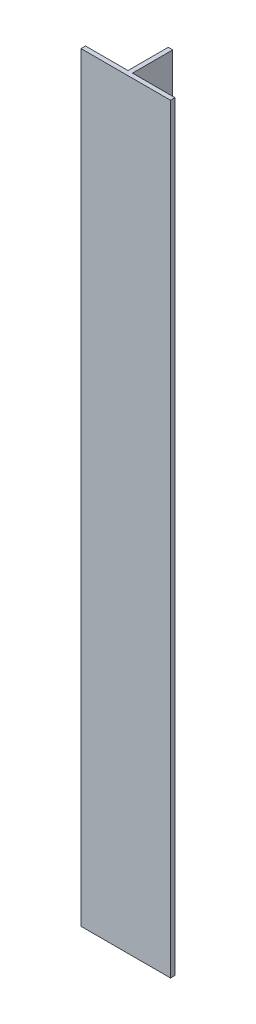
ISO-10303-21;
HEADER;
FILE_DESCRIPTION(('STEP AP214'),'2;1');
FILE_NAME('part.step','',(''),(''),'','','');
FILE_SCHEMA(('AUTOMOTIVE_DESIGN { 1 0 10303 214 1 1 1 1 }'));
ENDSEC;
DATA;
#1=APPLICATION_CONTEXT('core data for automotive mechanical design processes');
#2=APPLICATION_PROTOCOL_DEFINITION('international standard','automotive_design',2000,#1);
#3=PRODUCT_CONTEXT('',#1,'mechanical');
#4=PRODUCT('Part','Part','',(#3));
#5=PRODUCT_RELATED_PRODUCT_CATEGORY('part','',(#4));
#6=PRODUCT_DEFINITION_FORMATION('','',#4);
#7=PRODUCT_DEFINITION_CONTEXT('part definition',#1,'design');
#8=PRODUCT_DEFINITION('design','',#6,#7);
#9=PRODUCT_DEFINITION_SHAPE('','',#8);
#10=(LENGTH_UNIT() NAMED_UNIT(*) SI_UNIT(.MILLI.,.METRE.));
#11=(NAMED_UNIT(*) PLANE_ANGLE_UNIT() SI_UNIT($,.RADIAN.));
#12=(NAMED_UNIT(*) SI_UNIT($,.STERADIAN.) SOLID_ANGLE_UNIT());
#13=UNCERTAINTY_MEASURE_WITH_UNIT(LENGTH_MEASURE(1.E-05),#10,'distance_accuracy_value','');
#14=(GEOMETRIC_REPRESENTATION_CONTEXT(3) GLOBAL_UNCERTAINTY_ASSIGNED_CONTEXT((#13)) GLOBAL_UNIT_ASSIGNED_CONTEXT((#10,
#11,#12)) REPRESENTATION_CONTEXT('',''));
#15=CARTESIAN_POINT('',(0.,0.,0.));
#16=DIRECTION('',(0.,0.,1.));
#17=DIRECTION('',(1.,0.,0.));
#18=AXIS2_PLACEMENT_3D('',#15,#16,#17);
#19=CARTESIAN_POINT('',(-19.,340.,-5.36108675888797));
#20=DIRECTION('',(0.,0.,1.));
#21=DIRECTION('',(1.,0.,0.));
#22=AXIS2_PLACEMENT_3D('',#19,#20,#21);
#23=PLANE('',#22);
#24=DIRECTION('',(-1.,0.,0.));
#25=VECTOR('',#24,1.);
#26=CARTESIAN_POINT('',(-19.,0.,-5.36108675888797));
#27=LINE('',#26,#25);
#28=CARTESIAN_POINT('',(0.,0.,-5.36108675888797));
#29=VERTEX_POINT('',#28);
#30=CARTESIAN_POINT('',(-19.,0.,-5.36108675888797));
#31=VERTEX_POINT('',#30);
#32=EDGE_CURVE('E129',#29,#31,#27,.T.);
#33=ORIENTED_EDGE('',*,*,#32,.T.);
#34=DIRECTION('',(0.,-1.,0.));
#35=VECTOR('',#34,1.);
#36=CARTESIAN_POINT('',(-19.,340.,-5.36108675888797));
#37=LINE('',#36,#35);
#38=CARTESIAN_POINT('',(-19.,340.,-5.36108675888797));
#39=VERTEX_POINT('',#38);
#40=EDGE_CURVE('E11',#39,#31,#37,.T.);
#41=ORIENTED_EDGE('',*,*,#40,.F.);
#42=DIRECTION('',(-1.,0.,0.));
#43=VECTOR('',#42,1.);
#44=CARTESIAN_POINT('',(-19.,340.,-5.36108675888797));
#45=LINE('',#44,#43);
#46=CARTESIAN_POINT('',(0.,340.,-5.36108675888797));
#47=VERTEX_POINT('',#46);
#48=EDGE_CURVE('E143',#47,#39,#45,.T.);
#49=ORIENTED_EDGE('',*,*,#48,.F.);
#50=DIRECTION('',(0.,-1.,0.));
#51=VECTOR('',#50,1.);
#52=CARTESIAN_POINT('',(0.,340.,-5.36108675888797));
#53=LINE('',#52,#51);
#54=EDGE_CURVE('E125',#47,#29,#53,.T.);
#55=ORIENTED_EDGE('',*,*,#54,.T.);
#56=EDGE_LOOP('',(#33,#41,#49,#55));
#57=FACE_BOUND('',#56,.T.);
#58=ADVANCED_FACE('F33',(#57),#23,.F.);
#59=CARTESIAN_POINT('',(-19.,340.,-3.36108675888797));
#60=DIRECTION('',(1.,0.,0.));
#61=DIRECTION('',(0.,0.,-1.));
#62=AXIS2_PLACEMENT_3D('',#59,#60,#61);
#63=PLANE('',#62);
#64=DIRECTION('',(0.,0.,1.));
#65=VECTOR('',#64,1.);
#66=CARTESIAN_POINT('',(-19.,0.,-3.36108675888797));
#67=LINE('',#66,#65);
#68=CARTESIAN_POINT('',(-19.,0.,-3.36108675888797));
#69=VERTEX_POINT('',#68);
#70=EDGE_CURVE('E132',#31,#69,#67,.T.);
#71=ORIENTED_EDGE('',*,*,#70,.T.);
#72=DIRECTION('',(0.,-1.,0.));
#73=VECTOR('',#72,1.);
#74=CARTESIAN_POINT('',(-19.,340.,-3.36108675888797));
#75=LINE('',#74,#73);
#76=CARTESIAN_POINT('',(-19.,340.,-3.36108675888797));
#77=VERTEX_POINT('',#76);
#78=EDGE_CURVE('E41',#77,#69,#75,.T.);
#79=ORIENTED_EDGE('',*,*,#78,.F.);
#80=DIRECTION('',(0.,0.,1.));
#81=VECTOR('',#80,1.);
#82=CARTESIAN_POINT('',(-19.,340.,-3.36108675888797));
#83=LINE('',#82,#81);
#84=EDGE_CURVE('E92',#39,#77,#83,.T.);
#85=ORIENTED_EDGE('',*,*,#84,.F.);
#86=ORIENTED_EDGE('',*,*,#40,.T.);
#87=EDGE_LOOP('',(#71,#79,#85,#86));
#88=FACE_BOUND('',#87,.T.);
#89=ADVANCED_FACE('F178',(#88),#63,.F.);
#90=CARTESIAN_POINT('',(21.,340.,-3.36108675888797));
#91=DIRECTION('',(0.,0.,-1.));
#92=DIRECTION('',(-1.,0.,0.));
#93=AXIS2_PLACEMENT_3D('',#90,#91,#92);
#94=PLANE('',#93);
#95=DIRECTION('',(1.,0.,0.));
#96=VECTOR('',#95,1.);
#97=CARTESIAN_POINT('',(21.,0.,-3.36108675888797));
#98=LINE('',#97,#96);
#99=CARTESIAN_POINT('',(21.,0.,-3.36108675888797));
#100=VERTEX_POINT('',#99);
#101=EDGE_CURVE('E134',#69,#100,#98,.T.);
#102=ORIENTED_EDGE('',*,*,#101,.T.);
#103=DIRECTION('',(0.,-1.,0.));
#104=VECTOR('',#103,1.);
#105=CARTESIAN_POINT('',(21.,340.,-3.36108675888797));
#106=LINE('',#105,#104);
#107=CARTESIAN_POINT('',(21.,340.,-3.36108675888797));
#108=VERTEX_POINT('',#107);
#109=EDGE_CURVE('E150',#108,#100,#106,.T.);
#110=ORIENTED_EDGE('',*,*,#109,.F.);
#111=DIRECTION('',(1.,0.,0.));
#112=VECTOR('',#111,1.);
#113=CARTESIAN_POINT('',(21.,340.,-3.36108675888797));
#114=LINE('',#113,#112);
#115=EDGE_CURVE('E158',#77,#108,#114,.T.);
#116=ORIENTED_EDGE('',*,*,#115,.F.);
#117=ORIENTED_EDGE('',*,*,#78,.T.);
#118=EDGE_LOOP('',(#102,#110,#116,#117));
#119=FACE_BOUND('',#118,.T.);
#120=ADVANCED_FACE('F156',(#119),#94,.F.);
#121=CARTESIAN_POINT('',(21.,340.,-5.36108675888797));
#122=DIRECTION('',(-1.,0.,0.));
#123=DIRECTION('',(0.,0.,1.));
#124=AXIS2_PLACEMENT_3D('',#121,#122,#123);
#125=PLANE('',#124);
#126=DIRECTION('',(0.,0.,-1.));
#127=VECTOR('',#126,1.);
#128=CARTESIAN_POINT('',(21.,0.,-5.36108675888797));
#129=LINE('',#128,#127);
#130=CARTESIAN_POINT('',(21.,0.,-5.36108675888797));
#131=VERTEX_POINT('',#130);
#132=EDGE_CURVE('E136',#100,#131,#129,.T.);
#133=ORIENTED_EDGE('',*,*,#132,.T.);
#134=DIRECTION('',(0.,-1.,0.));
#135=VECTOR('',#134,1.);
#136=CARTESIAN_POINT('',(21.,340.,-5.36108675888797));
#137=LINE('',#136,#135);
#138=CARTESIAN_POINT('',(21.,340.,-5.36108675888797));
#139=VERTEX_POINT('',#138);
#140=EDGE_CURVE('E147',#139,#131,#137,.T.);
#141=ORIENTED_EDGE('',*,*,#140,.F.);
#142=DIRECTION('',(0.,0.,-1.));
#143=VECTOR('',#142,1.);
#144=CARTESIAN_POINT('',(21.,340.,-5.36108675888797));
#145=LINE('',#144,#143);
#146=EDGE_CURVE('E170',#108,#139,#145,.T.);
#147=ORIENTED_EDGE('',*,*,#146,.F.);
#148=ORIENTED_EDGE('',*,*,#109,.T.);
#149=EDGE_LOOP('',(#133,#141,#147,#148));
#150=FACE_BOUND('',#149,.T.);
#151=ADVANCED_FACE('F166',(#150),#125,.F.);
#152=CARTESIAN_POINT('',(2.,340.,-5.36108675888797));
#153=DIRECTION('',(0.,0.,1.));
#154=DIRECTION('',(1.,0.,0.));
#155=AXIS2_PLACEMENT_3D('',#152,#153,#154);
#156=PLANE('',#155);
#157=DIRECTION('',(-1.,0.,0.));
#158=VECTOR('',#157,1.);
#159=CARTESIAN_POINT('',(2.,0.,-5.36108675888797));
#160=LINE('',#159,#158);
#161=CARTESIAN_POINT('',(2.,0.,-5.36108675888797));
#162=VERTEX_POINT('',#161);
#163=EDGE_CURVE('E138',#131,#162,#160,.T.);
#164=ORIENTED_EDGE('',*,*,#163,.T.);
#165=DIRECTION('',(0.,-1.,0.));
#166=VECTOR('',#165,1.);
#167=CARTESIAN_POINT('',(2.,340.,-5.36108675888797));
#168=LINE('',#167,#166);
#169=CARTESIAN_POINT('',(2.,340.,-5.36108675888797));
#170=VERTEX_POINT('',#169);
#171=EDGE_CURVE('E120',#170,#162,#168,.T.);
#172=ORIENTED_EDGE('',*,*,#171,.F.);
#173=DIRECTION('',(-1.,0.,0.));
#174=VECTOR('',#173,1.);
#175=CARTESIAN_POINT('',(2.,340.,-5.36108675888797));
#176=LINE('',#175,#174);
#177=EDGE_CURVE('E111',#139,#170,#176,.T.);
#178=ORIENTED_EDGE('',*,*,#177,.F.);
#179=ORIENTED_EDGE('',*,*,#140,.T.);
#180=EDGE_LOOP('',(#164,#172,#178,#179));
#181=FACE_BOUND('',#180,.T.);
#182=ADVANCED_FACE('F169',(#181),#156,.F.);
#183=CARTESIAN_POINT('',(2.,340.,-23.361086758888));
#184=DIRECTION('',(-1.,0.,0.));
#185=DIRECTION('',(0.,0.,1.));
#186=AXIS2_PLACEMENT_3D('',#183,#184,#185);
#187=PLANE('',#186);
#188=DIRECTION('',(0.,0.,-1.));
#189=VECTOR('',#188,1.);
#190=CARTESIAN_POINT('',(2.,0.,-23.361086758888));
#191=LINE('',#190,#189);
#192=CARTESIAN_POINT('',(2.,0.,-23.361086758888));
#193=VERTEX_POINT('',#192);
#194=EDGE_CURVE('E119',#162,#193,#191,.T.);
#195=ORIENTED_EDGE('',*,*,#194,.T.);
#196=DIRECTION('',(0.,-1.,0.));
#197=VECTOR('',#196,1.);
#198=CARTESIAN_POINT('',(2.,340.,-23.361086758888));
#199=LINE('',#198,#197);
#200=CARTESIAN_POINT('',(2.,340.,-23.361086758888));
#201=VERTEX_POINT('',#200);
#202=EDGE_CURVE('E116',#201,#193,#199,.T.);
#203=ORIENTED_EDGE('',*,*,#202,.F.);
#204=DIRECTION('',(0.,0.,-1.));
#205=VECTOR('',#204,1.);
#206=CARTESIAN_POINT('',(2.,340.,-23.361086758888));
#207=LINE('',#206,#205);
#208=EDGE_CURVE('E105',#170,#201,#207,.T.);
#209=ORIENTED_EDGE('',*,*,#208,.F.);
#210=ORIENTED_EDGE('',*,*,#171,.T.);
#211=EDGE_LOOP('',(#195,#203,#209,#210));
#212=FACE_BOUND('',#211,.T.);
#213=ADVANCED_FACE('F117',(#212),#187,.F.);
#214=CARTESIAN_POINT('',(0.,340.,-23.361086758888));
#215=DIRECTION('',(0.,0.,1.));
#216=DIRECTION('',(1.,0.,0.));
#217=AXIS2_PLACEMENT_3D('',#214,#215,#216);
#218=PLANE('',#217);
#219=DIRECTION('',(-1.,0.,0.));
#220=VECTOR('',#219,1.);
#221=CARTESIAN_POINT('',(0.,0.,-23.361086758888));
#222=LINE('',#221,#220);
#223=CARTESIAN_POINT('',(0.,0.,-23.361086758888));
#224=VERTEX_POINT('',#223);
#225=EDGE_CURVE('E78',#193,#224,#222,.T.);
#226=ORIENTED_EDGE('',*,*,#225,.T.);
#227=DIRECTION('',(0.,-1.,0.));
#228=VECTOR('',#227,1.);
#229=CARTESIAN_POINT('',(0.,340.,-23.361086758888));
#230=LINE('',#229,#228);
#231=CARTESIAN_POINT('',(0.,340.,-23.361086758888));
#232=VERTEX_POINT('',#231);
#233=EDGE_CURVE('E121',#232,#224,#230,.T.);
#234=ORIENTED_EDGE('',*,*,#233,.F.);
#235=DIRECTION('',(-1.,0.,0.));
#236=VECTOR('',#235,1.);
#237=CARTESIAN_POINT('',(0.,340.,-23.361086758888));
#238=LINE('',#237,#236);
#239=EDGE_CURVE('E109',#201,#232,#238,.T.);
#240=ORIENTED_EDGE('',*,*,#239,.F.);
#241=ORIENTED_EDGE('',*,*,#202,.T.);
#242=EDGE_LOOP('',(#226,#234,#240,#241));
#243=FACE_BOUND('',#242,.T.);
#244=ADVANCED_FACE('F123',(#243),#218,.F.);
#245=CARTESIAN_POINT('',(0.,340.,-5.36108675888797));
#246=DIRECTION('',(1.,0.,0.));
#247=DIRECTION('',(0.,0.,-1.));
#248=AXIS2_PLACEMENT_3D('',#245,#246,#247);
#249=PLANE('',#248);
#250=DIRECTION('',(0.,0.,1.));
#251=VECTOR('',#250,1.);
#252=CARTESIAN_POINT('',(0.,0.,-5.36108675888797));
#253=LINE('',#252,#251);
#254=EDGE_CURVE('E84',#224,#29,#253,.T.);
#255=ORIENTED_EDGE('',*,*,#254,.T.);
#256=ORIENTED_EDGE('',*,*,#54,.F.);
#257=DIRECTION('',(0.,0.,1.));
#258=VECTOR('',#257,1.);
#259=CARTESIAN_POINT('',(0.,340.,-5.36108675888797));
#260=LINE('',#259,#258);
#261=EDGE_CURVE('E49',#232,#47,#260,.T.);
#262=ORIENTED_EDGE('',*,*,#261,.F.);
#263=ORIENTED_EDGE('',*,*,#233,.T.);
#264=EDGE_LOOP('',(#255,#256,#262,#263));
#265=FACE_BOUND('',#264,.T.);
#266=ADVANCED_FACE('F194',(#265),#249,.F.);
#267=CARTESIAN_POINT('',(0.,340.,0.));
#268=DIRECTION('',(0.,1.,0.));
#269=DIRECTION('',(0.,0.,1.));
#270=AXIS2_PLACEMENT_3D('',#267,#268,#269);
#271=PLANE('',#270);
#272=ORIENTED_EDGE('',*,*,#48,.T.);
#273=ORIENTED_EDGE('',*,*,#84,.T.);
#274=ORIENTED_EDGE('',*,*,#115,.T.);
#275=ORIENTED_EDGE('',*,*,#146,.T.);
#276=ORIENTED_EDGE('',*,*,#177,.T.);
#277=ORIENTED_EDGE('',*,*,#208,.T.);
#278=ORIENTED_EDGE('',*,*,#239,.T.);
#279=ORIENTED_EDGE('',*,*,#261,.T.);
#280=EDGE_LOOP('',(#272,#273,#274,#275,#276,#277,#278,#279));
#281=FACE_BOUND('',#280,.T.);
#282=ADVANCED_FACE('F107',(#281),#271,.T.);
#283=CARTESIAN_POINT('',(0.,0.,0.));
#284=DIRECTION('',(0.,1.,0.));
#285=DIRECTION('',(0.,0.,1.));
#286=AXIS2_PLACEMENT_3D('',#283,#284,#285);
#287=PLANE('',#286);
#288=ORIENTED_EDGE('',*,*,#32,.F.);
#289=ORIENTED_EDGE('',*,*,#254,.F.);
#290=ORIENTED_EDGE('',*,*,#225,.F.);
#291=ORIENTED_EDGE('',*,*,#194,.F.);
#292=ORIENTED_EDGE('',*,*,#163,.F.);
#293=ORIENTED_EDGE('',*,*,#132,.F.);
#294=ORIENTED_EDGE('',*,*,#101,.F.);
#295=ORIENTED_EDGE('',*,*,#70,.F.);
#296=EDGE_LOOP('',(#288,#289,#290,#291,#292,#293,#294,#295));
#297=FACE_BOUND('',#296,.T.);
#298=ADVANCED_FACE('F162',(#297),#287,.F.);
#299=CLOSED_SHELL('',(#58,#89,#120,#151,#182,#213,#244,#266,#282,#298));
#300=MANIFOLD_SOLID_BREP('B2',#299);
#301=ADVANCED_BREP_SHAPE_REPRESENTATION('',(#18,#300),#14);
#302=SHAPE_DEFINITION_REPRESENTATION(#9,#301);
ENDSEC;
END-ISO-10303-21;
